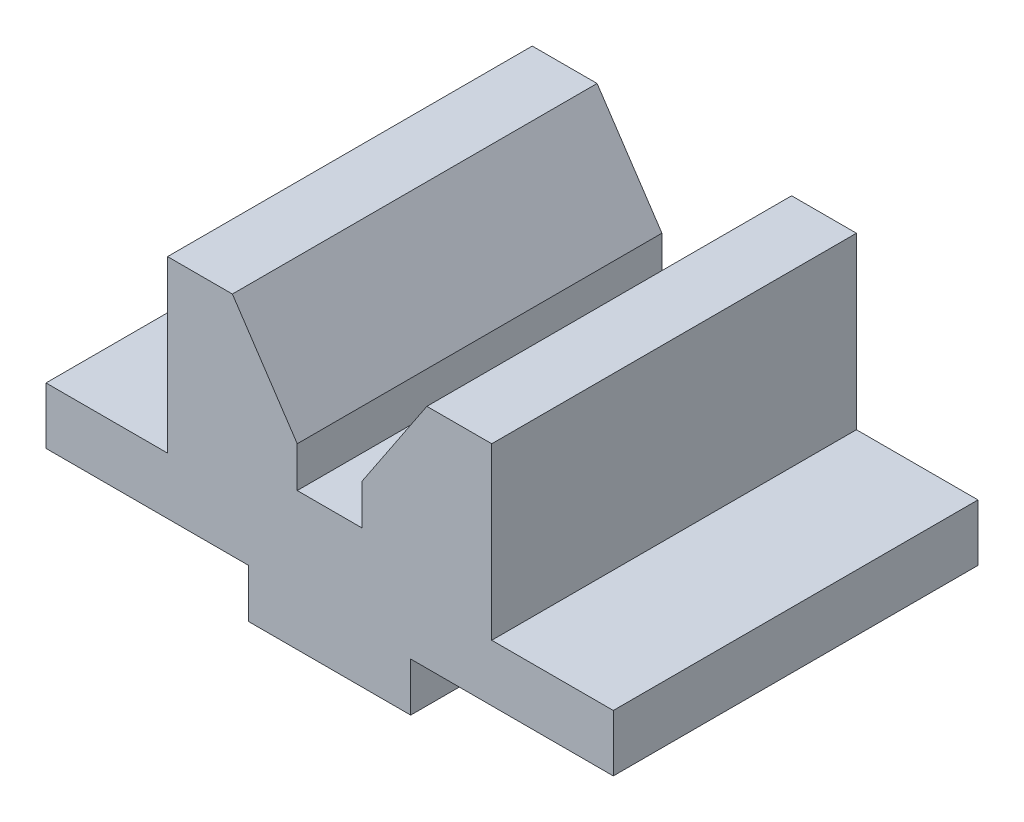
ISO-10303-21;
HEADER;
FILE_DESCRIPTION(('STEP AP214'),'2;1');
FILE_NAME('part.step','',(''),(''),'','','');
FILE_SCHEMA(('AUTOMOTIVE_DESIGN { 1 0 10303 214 1 1 1 1 }'));
ENDSEC;
DATA;
#1=APPLICATION_CONTEXT('core data for automotive mechanical design processes');
#2=APPLICATION_PROTOCOL_DEFINITION('international standard','automotive_design',2000,#1);
#3=PRODUCT_CONTEXT('',#1,'mechanical');
#4=PRODUCT('Part','Part','',(#3));
#5=PRODUCT_RELATED_PRODUCT_CATEGORY('part','',(#4));
#6=PRODUCT_DEFINITION_FORMATION('','',#4);
#7=PRODUCT_DEFINITION_CONTEXT('part definition',#1,'design');
#8=PRODUCT_DEFINITION('design','',#6,#7);
#9=PRODUCT_DEFINITION_SHAPE('','',#8);
#10=(LENGTH_UNIT() NAMED_UNIT(*) SI_UNIT(.MILLI.,.METRE.));
#11=(NAMED_UNIT(*) PLANE_ANGLE_UNIT() SI_UNIT($,.RADIAN.));
#12=(NAMED_UNIT(*) SI_UNIT($,.STERADIAN.) SOLID_ANGLE_UNIT());
#13=UNCERTAINTY_MEASURE_WITH_UNIT(LENGTH_MEASURE(1.E-05),#10,'distance_accuracy_value','');
#14=(GEOMETRIC_REPRESENTATION_CONTEXT(3) GLOBAL_UNCERTAINTY_ASSIGNED_CONTEXT((#13)) GLOBAL_UNIT_ASSIGNED_CONTEXT((#10,
#11,#12)) REPRESENTATION_CONTEXT('',''));
#15=CARTESIAN_POINT('',(0.,0.,0.));
#16=DIRECTION('',(0.,0.,1.));
#17=DIRECTION('',(1.,0.,0.));
#18=AXIS2_PLACEMENT_3D('',#15,#16,#17);
#19=CARTESIAN_POINT('',(10.,0.,45.));
#20=DIRECTION('',(-1.,0.,0.));
#21=DIRECTION('',(0.,0.,1.));
#22=AXIS2_PLACEMENT_3D('',#19,#20,#21);
#23=PLANE('',#22);
#24=DIRECTION('',(0.,1.,0.));
#25=VECTOR('',#24,1.);
#26=CARTESIAN_POINT('',(10.,0.,0.));
#27=LINE('',#26,#25);
#28=CARTESIAN_POINT('',(10.,0.,0.));
#29=VERTEX_POINT('',#28);
#30=CARTESIAN_POINT('',(10.,6.,0.));
#31=VERTEX_POINT('',#30);
#32=EDGE_CURVE('E206',#29,#31,#27,.T.);
#33=ORIENTED_EDGE('',*,*,#32,.T.);
#34=DIRECTION('',(0.,0.,-1.));
#35=VECTOR('',#34,1.);
#36=CARTESIAN_POINT('',(10.,6.,45.));
#37=LINE('',#36,#35);
#38=CARTESIAN_POINT('',(10.,6.,45.));
#39=VERTEX_POINT('',#38);
#40=EDGE_CURVE('E11',#39,#31,#37,.T.);
#41=ORIENTED_EDGE('',*,*,#40,.F.);
#42=DIRECTION('',(0.,1.,0.));
#43=VECTOR('',#42,1.);
#44=CARTESIAN_POINT('',(10.,0.,45.));
#45=LINE('',#44,#43);
#46=CARTESIAN_POINT('',(10.,0.,45.));
#47=VERTEX_POINT('',#46);
#48=EDGE_CURVE('E258',#47,#39,#45,.T.);
#49=ORIENTED_EDGE('',*,*,#48,.F.);
#50=DIRECTION('',(0.,0.,-1.));
#51=VECTOR('',#50,1.);
#52=CARTESIAN_POINT('',(10.,0.,45.));
#53=LINE('',#52,#51);
#54=EDGE_CURVE('E202',#47,#29,#53,.T.);
#55=ORIENTED_EDGE('',*,*,#54,.T.);
#56=EDGE_LOOP('',(#33,#41,#49,#55));
#57=FACE_BOUND('',#56,.T.);
#58=ADVANCED_FACE('F45',(#57),#23,.F.);
#59=CARTESIAN_POINT('',(10.,6.,45.));
#60=DIRECTION('',(0.,1.,0.));
#61=DIRECTION('',(0.,0.,1.));
#62=AXIS2_PLACEMENT_3D('',#59,#60,#61);
#63=PLANE('',#62);
#64=DIRECTION('',(1.,0.,0.));
#65=VECTOR('',#64,1.);
#66=CARTESIAN_POINT('',(10.,6.,0.));
#67=LINE('',#66,#65);
#68=CARTESIAN_POINT('',(35.,6.,0.));
#69=VERTEX_POINT('',#68);
#70=EDGE_CURVE('E210',#31,#69,#67,.T.);
#71=ORIENTED_EDGE('',*,*,#70,.T.);
#72=DIRECTION('',(0.,0.,-1.));
#73=VECTOR('',#72,1.);
#74=CARTESIAN_POINT('',(35.,6.,45.));
#75=LINE('',#74,#73);
#76=CARTESIAN_POINT('',(35.,6.,45.));
#77=VERTEX_POINT('',#76);
#78=EDGE_CURVE('E54',#77,#69,#75,.T.);
#79=ORIENTED_EDGE('',*,*,#78,.F.);
#80=DIRECTION('',(1.,0.,0.));
#81=VECTOR('',#80,1.);
#82=CARTESIAN_POINT('',(10.,6.,45.));
#83=LINE('',#82,#81);
#84=EDGE_CURVE('E135',#39,#77,#83,.T.);
#85=ORIENTED_EDGE('',*,*,#84,.F.);
#86=ORIENTED_EDGE('',*,*,#40,.T.);
#87=EDGE_LOOP('',(#71,#79,#85,#86));
#88=FACE_BOUND('',#87,.T.);
#89=ADVANCED_FACE('F394',(#88),#63,.F.);
#90=CARTESIAN_POINT('',(35.,6.,45.));
#91=DIRECTION('',(-1.,0.,0.));
#92=DIRECTION('',(0.,0.,1.));
#93=AXIS2_PLACEMENT_3D('',#90,#91,#92);
#94=PLANE('',#93);
#95=DIRECTION('',(0.,1.,0.));
#96=VECTOR('',#95,1.);
#97=CARTESIAN_POINT('',(35.,6.,0.));
#98=LINE('',#97,#96);
#99=CARTESIAN_POINT('',(35.,13.,0.));
#100=VERTEX_POINT('',#99);
#101=EDGE_CURVE('E213',#69,#100,#98,.T.);
#102=ORIENTED_EDGE('',*,*,#101,.T.);
#103=DIRECTION('',(0.,0.,-1.));
#104=VECTOR('',#103,1.);
#105=CARTESIAN_POINT('',(35.,13.,45.));
#106=LINE('',#105,#104);
#107=CARTESIAN_POINT('',(35.,13.,45.));
#108=VERTEX_POINT('',#107);
#109=EDGE_CURVE('E309',#108,#100,#106,.T.);
#110=ORIENTED_EDGE('',*,*,#109,.F.);
#111=DIRECTION('',(0.,1.,0.));
#112=VECTOR('',#111,1.);
#113=CARTESIAN_POINT('',(35.,6.,45.));
#114=LINE('',#113,#112);
#115=EDGE_CURVE('E319',#77,#108,#114,.T.);
#116=ORIENTED_EDGE('',*,*,#115,.F.);
#117=ORIENTED_EDGE('',*,*,#78,.T.);
#118=EDGE_LOOP('',(#102,#110,#116,#117));
#119=FACE_BOUND('',#118,.T.);
#120=ADVANCED_FACE('F317',(#119),#94,.F.);
#121=CARTESIAN_POINT('',(35.,13.,45.));
#122=DIRECTION('',(0.,-1.,0.));
#123=DIRECTION('',(1.,0.,0.));
#124=AXIS2_PLACEMENT_3D('',#121,#122,#123);
#125=PLANE('',#124);
#126=DIRECTION('',(-1.,0.,0.));
#127=VECTOR('',#126,1.);
#128=CARTESIAN_POINT('',(35.,13.,0.));
#129=LINE('',#128,#127);
#130=CARTESIAN_POINT('',(20.,13.,0.));
#131=VERTEX_POINT('',#130);
#132=EDGE_CURVE('E216',#100,#131,#129,.T.);
#133=ORIENTED_EDGE('',*,*,#132,.T.);
#134=DIRECTION('',(0.,0.,-1.));
#135=VECTOR('',#134,1.);
#136=CARTESIAN_POINT('',(20.,13.,45.));
#137=LINE('',#136,#135);
#138=CARTESIAN_POINT('',(20.,13.,45.));
#139=VERTEX_POINT('',#138);
#140=EDGE_CURVE('E305',#139,#131,#137,.T.);
#141=ORIENTED_EDGE('',*,*,#140,.F.);
#142=DIRECTION('',(-1.,0.,0.));
#143=VECTOR('',#142,1.);
#144=CARTESIAN_POINT('',(35.,13.,45.));
#145=LINE('',#144,#143);
#146=EDGE_CURVE('E338',#108,#139,#145,.T.);
#147=ORIENTED_EDGE('',*,*,#146,.F.);
#148=ORIENTED_EDGE('',*,*,#109,.T.);
#149=EDGE_LOOP('',(#133,#141,#147,#148));
#150=FACE_BOUND('',#149,.T.);
#151=ADVANCED_FACE('F328',(#150),#125,.F.);
#152=CARTESIAN_POINT('',(20.,13.,45.));
#153=DIRECTION('',(-1.,0.,0.));
#154=DIRECTION('',(0.,0.,1.));
#155=AXIS2_PLACEMENT_3D('',#152,#153,#154);
#156=PLANE('',#155);
#157=DIRECTION('',(0.,1.,0.));
#158=VECTOR('',#157,1.);
#159=CARTESIAN_POINT('',(20.,13.,0.));
#160=LINE('',#159,#158);
#161=CARTESIAN_POINT('',(20.,34.,0.));
#162=VERTEX_POINT('',#161);
#163=EDGE_CURVE('E219',#131,#162,#160,.T.);
#164=ORIENTED_EDGE('',*,*,#163,.T.);
#165=DIRECTION('',(0.,0.,-1.));
#166=VECTOR('',#165,1.);
#167=CARTESIAN_POINT('',(20.,34.,45.));
#168=LINE('',#167,#166);
#169=CARTESIAN_POINT('',(20.,34.,45.));
#170=VERTEX_POINT('',#169);
#171=EDGE_CURVE('E301',#170,#162,#168,.T.);
#172=ORIENTED_EDGE('',*,*,#171,.F.);
#173=DIRECTION('',(0.,1.,0.));
#174=VECTOR('',#173,1.);
#175=CARTESIAN_POINT('',(20.,13.,45.));
#176=LINE('',#175,#174);
#177=EDGE_CURVE('E334',#139,#170,#176,.T.);
#178=ORIENTED_EDGE('',*,*,#177,.F.);
#179=ORIENTED_EDGE('',*,*,#140,.T.);
#180=EDGE_LOOP('',(#164,#172,#178,#179));
#181=FACE_BOUND('',#180,.T.);
#182=ADVANCED_FACE('F332',(#181),#156,.F.);
#183=CARTESIAN_POINT('',(20.,34.,45.));
#184=DIRECTION('',(0.,-1.,0.));
#185=DIRECTION('',(0.,0.,-1.));
#186=AXIS2_PLACEMENT_3D('',#183,#184,#185);
#187=PLANE('',#186);
#188=DIRECTION('',(-1.,0.,0.));
#189=VECTOR('',#188,1.);
#190=CARTESIAN_POINT('',(20.,34.,0.));
#191=LINE('',#190,#189);
#192=CARTESIAN_POINT('',(12.,34.,0.));
#193=VERTEX_POINT('',#192);
#194=EDGE_CURVE('E222',#162,#193,#191,.T.);
#195=ORIENTED_EDGE('',*,*,#194,.T.);
#196=DIRECTION('',(0.,0.,-1.));
#197=VECTOR('',#196,1.);
#198=CARTESIAN_POINT('',(12.,34.,45.));
#199=LINE('',#198,#197);
#200=CARTESIAN_POINT('',(12.,34.,45.));
#201=VERTEX_POINT('',#200);
#202=EDGE_CURVE('E297',#201,#193,#199,.T.);
#203=ORIENTED_EDGE('',*,*,#202,.F.);
#204=DIRECTION('',(-1.,0.,0.));
#205=VECTOR('',#204,1.);
#206=CARTESIAN_POINT('',(20.,34.,45.));
#207=LINE('',#206,#205);
#208=EDGE_CURVE('E337',#170,#201,#207,.T.);
#209=ORIENTED_EDGE('',*,*,#208,.F.);
#210=ORIENTED_EDGE('',*,*,#171,.T.);
#211=EDGE_LOOP('',(#195,#203,#209,#210));
#212=FACE_BOUND('',#211,.T.);
#213=ADVANCED_FACE('F407',(#212),#187,.F.);
#214=CARTESIAN_POINT('',(12.,34.,45.));
#215=DIRECTION('',(0.832050294337844,-0.554700196225229,0.));
#216=DIRECTION('',(0.554700196225229,0.832050294337844,0.));
#217=AXIS2_PLACEMENT_3D('',#214,#215,#216);
#218=PLANE('',#217);
#219=DIRECTION('',(-0.554700196225229,-0.832050294337844,0.));
#220=VECTOR('',#219,1.);
#221=CARTESIAN_POINT('',(12.,34.,0.));
#222=LINE('',#221,#220);
#223=CARTESIAN_POINT('',(4.00000000000001,22.,0.));
#224=VERTEX_POINT('',#223);
#225=EDGE_CURVE('E225',#193,#224,#222,.T.);
#226=ORIENTED_EDGE('',*,*,#225,.T.);
#227=DIRECTION('',(0.,0.,-1.));
#228=VECTOR('',#227,1.);
#229=CARTESIAN_POINT('',(4.00000000000001,22.,45.));
#230=LINE('',#229,#228);
#231=CARTESIAN_POINT('',(4.00000000000001,22.,45.));
#232=VERTEX_POINT('',#231);
#233=EDGE_CURVE('E293',#232,#224,#230,.T.);
#234=ORIENTED_EDGE('',*,*,#233,.F.);
#235=DIRECTION('',(-0.554700196225229,-0.832050294337844,0.));
#236=VECTOR('',#235,1.);
#237=CARTESIAN_POINT('',(12.,34.,45.));
#238=LINE('',#237,#236);
#239=EDGE_CURVE('E342',#201,#232,#238,.T.);
#240=ORIENTED_EDGE('',*,*,#239,.F.);
#241=ORIENTED_EDGE('',*,*,#202,.T.);
#242=EDGE_LOOP('',(#226,#234,#240,#241));
#243=FACE_BOUND('',#242,.T.);
#244=ADVANCED_FACE('F410',(#243),#218,.F.);
#245=CARTESIAN_POINT('',(4.00000000000001,22.,45.));
#246=DIRECTION('',(1.,0.,0.));
#247=DIRECTION('',(0.,1.,0.));
#248=AXIS2_PLACEMENT_3D('',#245,#246,#247);
#249=PLANE('',#248);
#250=DIRECTION('',(0.,-1.,0.));
#251=VECTOR('',#250,1.);
#252=CARTESIAN_POINT('',(4.00000000000001,22.,0.));
#253=LINE('',#252,#251);
#254=CARTESIAN_POINT('',(4.00000000000001,17.,0.));
#255=VERTEX_POINT('',#254);
#256=EDGE_CURVE('E228',#224,#255,#253,.T.);
#257=ORIENTED_EDGE('',*,*,#256,.T.);
#258=DIRECTION('',(0.,0.,-1.));
#259=VECTOR('',#258,1.);
#260=CARTESIAN_POINT('',(4.00000000000001,17.,45.));
#261=LINE('',#260,#259);
#262=CARTESIAN_POINT('',(4.00000000000001,17.,45.));
#263=VERTEX_POINT('',#262);
#264=EDGE_CURVE('E289',#263,#255,#261,.T.);
#265=ORIENTED_EDGE('',*,*,#264,.F.);
#266=DIRECTION('',(0.,-1.,0.));
#267=VECTOR('',#266,1.);
#268=CARTESIAN_POINT('',(4.00000000000001,22.,45.));
#269=LINE('',#268,#267);
#270=EDGE_CURVE('E349',#232,#263,#269,.T.);
#271=ORIENTED_EDGE('',*,*,#270,.F.);
#272=ORIENTED_EDGE('',*,*,#233,.T.);
#273=EDGE_LOOP('',(#257,#265,#271,#272));
#274=FACE_BOUND('',#273,.T.);
#275=ADVANCED_FACE('F414',(#274),#249,.F.);
#276=CARTESIAN_POINT('',(-4.,17.,45.));
#277=DIRECTION('',(0.,-1.,0.));
#278=DIRECTION('',(0.,0.,-1.));
#279=AXIS2_PLACEMENT_3D('',#276,#277,#278);
#280=PLANE('',#279);
#281=DIRECTION('',(-1.,0.,0.));
#282=VECTOR('',#281,1.);
#283=CARTESIAN_POINT('',(-4.,17.,0.));
#284=LINE('',#283,#282);
#285=CARTESIAN_POINT('',(-4.,17.,0.));
#286=VERTEX_POINT('',#285);
#287=EDGE_CURVE('E231',#255,#286,#284,.T.);
#288=ORIENTED_EDGE('',*,*,#287,.T.);
#289=DIRECTION('',(0.,0.,-1.));
#290=VECTOR('',#289,1.);
#291=CARTESIAN_POINT('',(-4.,17.,45.));
#292=LINE('',#291,#290);
#293=CARTESIAN_POINT('',(-4.,17.,45.));
#294=VERTEX_POINT('',#293);
#295=EDGE_CURVE('E285',#294,#286,#292,.T.);
#296=ORIENTED_EDGE('',*,*,#295,.F.);
#297=DIRECTION('',(-1.,0.,0.));
#298=VECTOR('',#297,1.);
#299=CARTESIAN_POINT('',(-4.,17.,45.));
#300=LINE('',#299,#298);
#301=EDGE_CURVE('E352',#263,#294,#300,.T.);
#302=ORIENTED_EDGE('',*,*,#301,.F.);
#303=ORIENTED_EDGE('',*,*,#264,.T.);
#304=EDGE_LOOP('',(#288,#296,#302,#303));
#305=FACE_BOUND('',#304,.T.);
#306=ADVANCED_FACE('F418',(#305),#280,.F.);
#307=CARTESIAN_POINT('',(-4.,22.,45.));
#308=DIRECTION('',(-1.,0.,0.));
#309=DIRECTION('',(0.,-1.,0.));
#310=AXIS2_PLACEMENT_3D('',#307,#308,#309);
#311=PLANE('',#310);
#312=DIRECTION('',(0.,1.,0.));
#313=VECTOR('',#312,1.);
#314=CARTESIAN_POINT('',(-4.,22.,0.));
#315=LINE('',#314,#313);
#316=CARTESIAN_POINT('',(-4.,22.,0.));
#317=VERTEX_POINT('',#316);
#318=EDGE_CURVE('E234',#286,#317,#315,.T.);
#319=ORIENTED_EDGE('',*,*,#318,.T.);
#320=DIRECTION('',(0.,0.,-1.));
#321=VECTOR('',#320,1.);
#322=CARTESIAN_POINT('',(-4.,22.,45.));
#323=LINE('',#322,#321);
#324=CARTESIAN_POINT('',(-4.,22.,45.));
#325=VERTEX_POINT('',#324);
#326=EDGE_CURVE('E281',#325,#317,#323,.T.);
#327=ORIENTED_EDGE('',*,*,#326,.F.);
#328=DIRECTION('',(0.,1.,0.));
#329=VECTOR('',#328,1.);
#330=CARTESIAN_POINT('',(-4.,22.,45.));
#331=LINE('',#330,#329);
#332=EDGE_CURVE('E355',#294,#325,#331,.T.);
#333=ORIENTED_EDGE('',*,*,#332,.F.);
#334=ORIENTED_EDGE('',*,*,#295,.T.);
#335=EDGE_LOOP('',(#319,#327,#333,#334));
#336=FACE_BOUND('',#335,.T.);
#337=ADVANCED_FACE('F422',(#336),#311,.F.);
#338=CARTESIAN_POINT('',(-12.,34.,45.));
#339=DIRECTION('',(-0.832050294337844,-0.554700196225229,0.));
#340=DIRECTION('',(0.554700196225229,-0.832050294337844,0.));
#341=AXIS2_PLACEMENT_3D('',#338,#339,#340);
#342=PLANE('',#341);
#343=DIRECTION('',(-0.554700196225229,0.832050294337844,0.));
#344=VECTOR('',#343,1.);
#345=CARTESIAN_POINT('',(-12.,34.,0.));
#346=LINE('',#345,#344);
#347=CARTESIAN_POINT('',(-12.,34.,0.));
#348=VERTEX_POINT('',#347);
#349=EDGE_CURVE('E237',#317,#348,#346,.T.);
#350=ORIENTED_EDGE('',*,*,#349,.T.);
#351=DIRECTION('',(0.,0.,-1.));
#352=VECTOR('',#351,1.);
#353=CARTESIAN_POINT('',(-12.,34.,45.));
#354=LINE('',#353,#352);
#355=CARTESIAN_POINT('',(-12.,34.,45.));
#356=VERTEX_POINT('',#355);
#357=EDGE_CURVE('E277',#356,#348,#354,.T.);
#358=ORIENTED_EDGE('',*,*,#357,.F.);
#359=DIRECTION('',(-0.554700196225229,0.832050294337844,0.));
#360=VECTOR('',#359,1.);
#361=CARTESIAN_POINT('',(-12.,34.,45.));
#362=LINE('',#361,#360);
#363=EDGE_CURVE('E358',#325,#356,#362,.T.);
#364=ORIENTED_EDGE('',*,*,#363,.F.);
#365=ORIENTED_EDGE('',*,*,#326,.T.);
#366=EDGE_LOOP('',(#350,#358,#364,#365));
#367=FACE_BOUND('',#366,.T.);
#368=ADVANCED_FACE('F426',(#367),#342,.F.);
#369=CARTESIAN_POINT('',(-20.,34.,45.));
#370=DIRECTION('',(0.,-1.,0.));
#371=DIRECTION('',(0.,0.,-1.));
#372=AXIS2_PLACEMENT_3D('',#369,#370,#371);
#373=PLANE('',#372);
#374=DIRECTION('',(-1.,0.,0.));
#375=VECTOR('',#374,1.);
#376=CARTESIAN_POINT('',(-20.,34.,0.));
#377=LINE('',#376,#375);
#378=CARTESIAN_POINT('',(-20.,34.,0.));
#379=VERTEX_POINT('',#378);
#380=EDGE_CURVE('E240',#348,#379,#377,.T.);
#381=ORIENTED_EDGE('',*,*,#380,.T.);
#382=DIRECTION('',(0.,0.,-1.));
#383=VECTOR('',#382,1.);
#384=CARTESIAN_POINT('',(-20.,34.,45.));
#385=LINE('',#384,#383);
#386=CARTESIAN_POINT('',(-20.,34.,45.));
#387=VERTEX_POINT('',#386);
#388=EDGE_CURVE('E273',#387,#379,#385,.T.);
#389=ORIENTED_EDGE('',*,*,#388,.F.);
#390=DIRECTION('',(-1.,0.,0.));
#391=VECTOR('',#390,1.);
#392=CARTESIAN_POINT('',(-20.,34.,45.));
#393=LINE('',#392,#391);
#394=EDGE_CURVE('E361',#356,#387,#393,.T.);
#395=ORIENTED_EDGE('',*,*,#394,.F.);
#396=ORIENTED_EDGE('',*,*,#357,.T.);
#397=EDGE_LOOP('',(#381,#389,#395,#396));
#398=FACE_BOUND('',#397,.T.);
#399=ADVANCED_FACE('F430',(#398),#373,.F.);
#400=CARTESIAN_POINT('',(-20.,13.,45.));
#401=DIRECTION('',(1.,0.,0.));
#402=DIRECTION('',(0.,0.,-1.));
#403=AXIS2_PLACEMENT_3D('',#400,#401,#402);
#404=PLANE('',#403);
#405=DIRECTION('',(0.,-1.,0.));
#406=VECTOR('',#405,1.);
#407=CARTESIAN_POINT('',(-20.,13.,0.));
#408=LINE('',#407,#406);
#409=CARTESIAN_POINT('',(-20.,13.,0.));
#410=VERTEX_POINT('',#409);
#411=EDGE_CURVE('E243',#379,#410,#408,.T.);
#412=ORIENTED_EDGE('',*,*,#411,.T.);
#413=DIRECTION('',(0.,0.,-1.));
#414=VECTOR('',#413,1.);
#415=CARTESIAN_POINT('',(-20.,13.,45.));
#416=LINE('',#415,#414);
#417=CARTESIAN_POINT('',(-20.,13.,45.));
#418=VERTEX_POINT('',#417);
#419=EDGE_CURVE('E269',#418,#410,#416,.T.);
#420=ORIENTED_EDGE('',*,*,#419,.F.);
#421=DIRECTION('',(0.,-1.,0.));
#422=VECTOR('',#421,1.);
#423=CARTESIAN_POINT('',(-20.,13.,45.));
#424=LINE('',#423,#422);
#425=EDGE_CURVE('E364',#387,#418,#424,.T.);
#426=ORIENTED_EDGE('',*,*,#425,.F.);
#427=ORIENTED_EDGE('',*,*,#388,.T.);
#428=EDGE_LOOP('',(#412,#420,#426,#427));
#429=FACE_BOUND('',#428,.T.);
#430=ADVANCED_FACE('F434',(#429),#404,.F.);
#431=CARTESIAN_POINT('',(-35.,13.,45.));
#432=DIRECTION('',(0.,-1.,0.));
#433=DIRECTION('',(1.,0.,0.));
#434=AXIS2_PLACEMENT_3D('',#431,#432,#433);
#435=PLANE('',#434);
#436=DIRECTION('',(-1.,0.,0.));
#437=VECTOR('',#436,1.);
#438=CARTESIAN_POINT('',(-35.,13.,0.));
#439=LINE('',#438,#437);
#440=CARTESIAN_POINT('',(-35.,13.,0.));
#441=VERTEX_POINT('',#440);
#442=EDGE_CURVE('E246',#410,#441,#439,.T.);
#443=ORIENTED_EDGE('',*,*,#442,.T.);
#444=DIRECTION('',(0.,0.,-1.));
#445=VECTOR('',#444,1.);
#446=CARTESIAN_POINT('',(-35.,13.,45.));
#447=LINE('',#446,#445);
#448=CARTESIAN_POINT('',(-35.,13.,45.));
#449=VERTEX_POINT('',#448);
#450=EDGE_CURVE('E265',#449,#441,#447,.T.);
#451=ORIENTED_EDGE('',*,*,#450,.F.);
#452=DIRECTION('',(-1.,0.,0.));
#453=VECTOR('',#452,1.);
#454=CARTESIAN_POINT('',(-35.,13.,45.));
#455=LINE('',#454,#453);
#456=EDGE_CURVE('E367',#418,#449,#455,.T.);
#457=ORIENTED_EDGE('',*,*,#456,.F.);
#458=ORIENTED_EDGE('',*,*,#419,.T.);
#459=EDGE_LOOP('',(#443,#451,#457,#458));
#460=FACE_BOUND('',#459,.T.);
#461=ADVANCED_FACE('F375',(#460),#435,.F.);
#462=CARTESIAN_POINT('',(-35.,6.,45.));
#463=DIRECTION('',(1.,0.,0.));
#464=DIRECTION('',(0.,0.,-1.));
#465=AXIS2_PLACEMENT_3D('',#462,#463,#464);
#466=PLANE('',#465);
#467=DIRECTION('',(0.,-1.,0.));
#468=VECTOR('',#467,1.);
#469=CARTESIAN_POINT('',(-35.,6.,0.));
#470=LINE('',#469,#468);
#471=CARTESIAN_POINT('',(-35.,6.,0.));
#472=VERTEX_POINT('',#471);
#473=EDGE_CURVE('E249',#441,#472,#470,.T.);
#474=ORIENTED_EDGE('',*,*,#473,.T.);
#475=DIRECTION('',(0.,0.,-1.));
#476=VECTOR('',#475,1.);
#477=CARTESIAN_POINT('',(-35.,6.,45.));
#478=LINE('',#477,#476);
#479=CARTESIAN_POINT('',(-35.,6.,45.));
#480=VERTEX_POINT('',#479);
#481=EDGE_CURVE('E195',#480,#472,#478,.T.);
#482=ORIENTED_EDGE('',*,*,#481,.F.);
#483=DIRECTION('',(0.,-1.,0.));
#484=VECTOR('',#483,1.);
#485=CARTESIAN_POINT('',(-35.,6.,45.));
#486=LINE('',#485,#484);
#487=EDGE_CURVE('E184',#449,#480,#486,.T.);
#488=ORIENTED_EDGE('',*,*,#487,.F.);
#489=ORIENTED_EDGE('',*,*,#450,.T.);
#490=EDGE_LOOP('',(#474,#482,#488,#489));
#491=FACE_BOUND('',#490,.T.);
#492=ADVANCED_FACE('F379',(#491),#466,.F.);
#493=CARTESIAN_POINT('',(-10.,6.,45.));
#494=DIRECTION('',(0.,1.,0.));
#495=DIRECTION('',(0.,0.,1.));
#496=AXIS2_PLACEMENT_3D('',#493,#494,#495);
#497=PLANE('',#496);
#498=DIRECTION('',(1.,0.,0.));
#499=VECTOR('',#498,1.);
#500=CARTESIAN_POINT('',(-10.,6.,0.));
#501=LINE('',#500,#499);
#502=CARTESIAN_POINT('',(-10.,6.,0.));
#503=VERTEX_POINT('',#502);
#504=EDGE_CURVE('E193',#472,#503,#501,.T.);
#505=ORIENTED_EDGE('',*,*,#504,.T.);
#506=DIRECTION('',(0.,0.,-1.));
#507=VECTOR('',#506,1.);
#508=CARTESIAN_POINT('',(-10.,6.,45.));
#509=LINE('',#508,#507);
#510=CARTESIAN_POINT('',(-10.,6.,45.));
#511=VERTEX_POINT('',#510);
#512=EDGE_CURVE('E190',#511,#503,#509,.T.);
#513=ORIENTED_EDGE('',*,*,#512,.F.);
#514=DIRECTION('',(1.,0.,0.));
#515=VECTOR('',#514,1.);
#516=CARTESIAN_POINT('',(-10.,6.,45.));
#517=LINE('',#516,#515);
#518=EDGE_CURVE('E178',#480,#511,#517,.T.);
#519=ORIENTED_EDGE('',*,*,#518,.F.);
#520=ORIENTED_EDGE('',*,*,#481,.T.);
#521=EDGE_LOOP('',(#505,#513,#519,#520));
#522=FACE_BOUND('',#521,.T.);
#523=ADVANCED_FACE('F191',(#522),#497,.F.);
#524=CARTESIAN_POINT('',(-10.,0.,45.));
#525=DIRECTION('',(1.,0.,0.));
#526=DIRECTION('',(0.,0.,-1.));
#527=AXIS2_PLACEMENT_3D('',#524,#525,#526);
#528=PLANE('',#527);
#529=DIRECTION('',(0.,-1.,0.));
#530=VECTOR('',#529,1.);
#531=CARTESIAN_POINT('',(-10.,0.,0.));
#532=LINE('',#531,#530);
#533=CARTESIAN_POINT('',(-10.,0.,0.));
#534=VERTEX_POINT('',#533);
#535=EDGE_CURVE('E121',#503,#534,#532,.T.);
#536=ORIENTED_EDGE('',*,*,#535,.T.);
#537=DIRECTION('',(0.,0.,-1.));
#538=VECTOR('',#537,1.);
#539=CARTESIAN_POINT('',(-10.,0.,45.));
#540=LINE('',#539,#538);
#541=CARTESIAN_POINT('',(-10.,0.,45.));
#542=VERTEX_POINT('',#541);
#543=EDGE_CURVE('E196',#542,#534,#540,.T.);
#544=ORIENTED_EDGE('',*,*,#543,.F.);
#545=DIRECTION('',(0.,-1.,0.));
#546=VECTOR('',#545,1.);
#547=CARTESIAN_POINT('',(-10.,0.,45.));
#548=LINE('',#547,#546);
#549=EDGE_CURVE('E182',#511,#542,#548,.T.);
#550=ORIENTED_EDGE('',*,*,#549,.F.);
#551=ORIENTED_EDGE('',*,*,#512,.T.);
#552=EDGE_LOOP('',(#536,#544,#550,#551));
#553=FACE_BOUND('',#552,.T.);
#554=ADVANCED_FACE('F198',(#553),#528,.F.);
#555=CARTESIAN_POINT('',(-10.,0.,45.));
#556=DIRECTION('',(0.,1.,0.));
#557=DIRECTION('',(0.,0.,1.));
#558=AXIS2_PLACEMENT_3D('',#555,#556,#557);
#559=PLANE('',#558);
#560=DIRECTION('',(1.,0.,0.));
#561=VECTOR('',#560,1.);
#562=CARTESIAN_POINT('',(-10.,0.,0.));
#563=LINE('',#562,#561);
#564=EDGE_CURVE('E127',#534,#29,#563,.T.);
#565=ORIENTED_EDGE('',*,*,#564,.T.);
#566=ORIENTED_EDGE('',*,*,#54,.F.);
#567=DIRECTION('',(1.,0.,0.));
#568=VECTOR('',#567,1.);
#569=CARTESIAN_POINT('',(-10.,0.,45.));
#570=LINE('',#569,#568);
#571=EDGE_CURVE('E62',#542,#47,#570,.T.);
#572=ORIENTED_EDGE('',*,*,#571,.F.);
#573=ORIENTED_EDGE('',*,*,#543,.T.);
#574=EDGE_LOOP('',(#565,#566,#572,#573));
#575=FACE_BOUND('',#574,.T.);
#576=ADVANCED_FACE('F383',(#575),#559,.F.);
#577=CARTESIAN_POINT('',(0.,0.,45.));
#578=DIRECTION('',(0.,0.,-1.));
#579=DIRECTION('',(-1.,0.,0.));
#580=AXIS2_PLACEMENT_3D('',#577,#578,#579);
#581=PLANE('',#580);
#582=ORIENTED_EDGE('',*,*,#48,.T.);
#583=ORIENTED_EDGE('',*,*,#84,.T.);
#584=ORIENTED_EDGE('',*,*,#115,.T.);
#585=ORIENTED_EDGE('',*,*,#146,.T.);
#586=ORIENTED_EDGE('',*,*,#177,.T.);
#587=ORIENTED_EDGE('',*,*,#208,.T.);
#588=ORIENTED_EDGE('',*,*,#239,.T.);
#589=ORIENTED_EDGE('',*,*,#270,.T.);
#590=ORIENTED_EDGE('',*,*,#301,.T.);
#591=ORIENTED_EDGE('',*,*,#332,.T.);
#592=ORIENTED_EDGE('',*,*,#363,.T.);
#593=ORIENTED_EDGE('',*,*,#394,.T.);
#594=ORIENTED_EDGE('',*,*,#425,.T.);
#595=ORIENTED_EDGE('',*,*,#456,.T.);
#596=ORIENTED_EDGE('',*,*,#487,.T.);
#597=ORIENTED_EDGE('',*,*,#518,.T.);
#598=ORIENTED_EDGE('',*,*,#549,.T.);
#599=ORIENTED_EDGE('',*,*,#571,.T.);
#600=EDGE_LOOP('',(#582,#583,#584,#585,#586,#587,#588,#589,#590,#591,#592,#593,#594,#595,#596,
#597,#598,#599));
#601=FACE_BOUND('',#600,.T.);
#602=ADVANCED_FACE('F180',(#601),#581,.F.);
#603=CARTESIAN_POINT('',(0.,0.,0.));
#604=DIRECTION('',(0.,0.,-1.));
#605=DIRECTION('',(-1.,0.,0.));
#606=AXIS2_PLACEMENT_3D('',#603,#604,#605);
#607=PLANE('',#606);
#608=ORIENTED_EDGE('',*,*,#32,.F.);
#609=ORIENTED_EDGE('',*,*,#564,.F.);
#610=ORIENTED_EDGE('',*,*,#535,.F.);
#611=ORIENTED_EDGE('',*,*,#504,.F.);
#612=ORIENTED_EDGE('',*,*,#473,.F.);
#613=ORIENTED_EDGE('',*,*,#442,.F.);
#614=ORIENTED_EDGE('',*,*,#411,.F.);
#615=ORIENTED_EDGE('',*,*,#380,.F.);
#616=ORIENTED_EDGE('',*,*,#349,.F.);
#617=ORIENTED_EDGE('',*,*,#318,.F.);
#618=ORIENTED_EDGE('',*,*,#287,.F.);
#619=ORIENTED_EDGE('',*,*,#256,.F.);
#620=ORIENTED_EDGE('',*,*,#225,.F.);
#621=ORIENTED_EDGE('',*,*,#194,.F.);
#622=ORIENTED_EDGE('',*,*,#163,.F.);
#623=ORIENTED_EDGE('',*,*,#132,.F.);
#624=ORIENTED_EDGE('',*,*,#101,.F.);
#625=ORIENTED_EDGE('',*,*,#70,.F.);
#626=EDGE_LOOP('',(#608,#609,#610,#611,#612,#613,#614,#615,#616,#617,#618,#619,#620,#621,#622,
#623,#624,#625));
#627=FACE_BOUND('',#626,.T.);
#628=ADVANCED_FACE('F323',(#627),#607,.T.);
#629=CLOSED_SHELL('',(#58,#89,#120,#151,#182,#213,#244,#275,#306,#337,#368,#399,#430,#461,#492,
#523,#554,#576,#602,#628));
#630=MANIFOLD_SOLID_BREP('B2',#629);
#631=ADVANCED_BREP_SHAPE_REPRESENTATION('',(#18,#630),#14);
#632=SHAPE_DEFINITION_REPRESENTATION(#9,#631);
ENDSEC;
END-ISO-10303-21;
